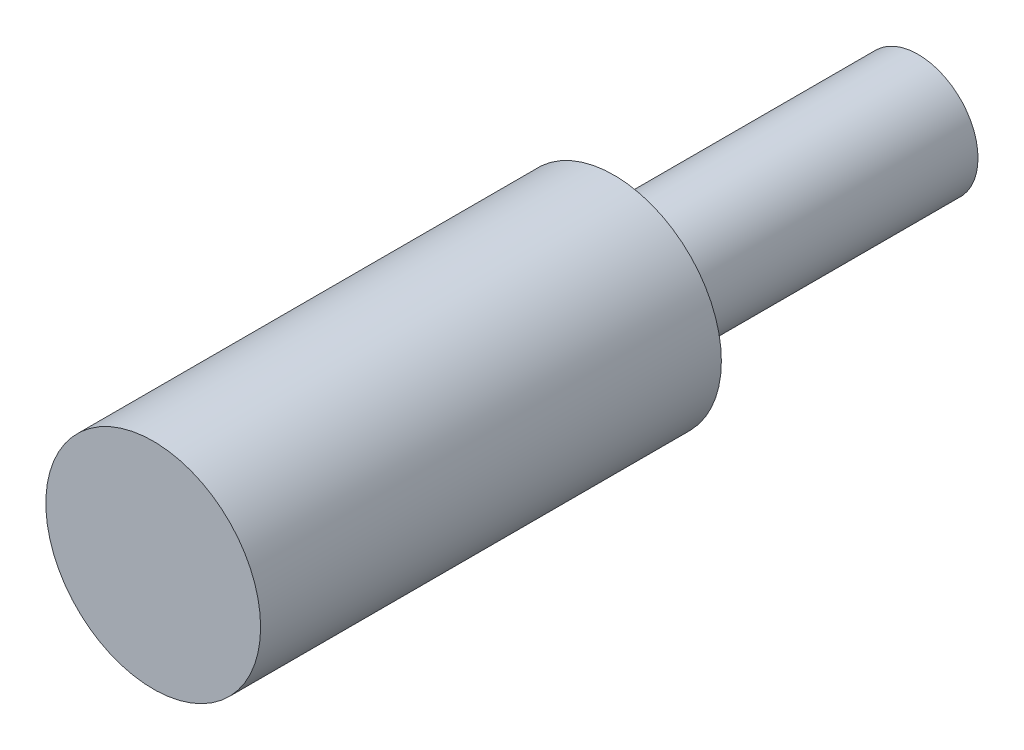
ISO-10303-21;
HEADER;
FILE_DESCRIPTION(('STEP AP214'),'2;1');
FILE_NAME('part.step','',(''),(''),'','','');
FILE_SCHEMA(('AUTOMOTIVE_DESIGN { 1 0 10303 214 1 1 1 1 }'));
ENDSEC;
DATA;
#1=APPLICATION_CONTEXT('core data for automotive mechanical design processes');
#2=APPLICATION_PROTOCOL_DEFINITION('international standard','automotive_design',2000,#1);
#3=PRODUCT_CONTEXT('',#1,'mechanical');
#4=PRODUCT('Part','Part','',(#3));
#5=PRODUCT_RELATED_PRODUCT_CATEGORY('part','',(#4));
#6=PRODUCT_DEFINITION_FORMATION('','',#4);
#7=PRODUCT_DEFINITION_CONTEXT('part definition',#1,'design');
#8=PRODUCT_DEFINITION('design','',#6,#7);
#9=PRODUCT_DEFINITION_SHAPE('','',#8);
#10=(LENGTH_UNIT() NAMED_UNIT(*) SI_UNIT(.MILLI.,.METRE.));
#11=(NAMED_UNIT(*) PLANE_ANGLE_UNIT() SI_UNIT($,.RADIAN.));
#12=(NAMED_UNIT(*) SI_UNIT($,.STERADIAN.) SOLID_ANGLE_UNIT());
#13=UNCERTAINTY_MEASURE_WITH_UNIT(LENGTH_MEASURE(1.E-05),#10,'distance_accuracy_value','');
#14=(GEOMETRIC_REPRESENTATION_CONTEXT(3) GLOBAL_UNCERTAINTY_ASSIGNED_CONTEXT((#13)) GLOBAL_UNIT_ASSIGNED_CONTEXT((#10,
#11,#12)) REPRESENTATION_CONTEXT('',''));
#15=CARTESIAN_POINT('',(0.,0.,0.));
#16=DIRECTION('',(0.,0.,1.));
#17=DIRECTION('',(1.,0.,0.));
#18=AXIS2_PLACEMENT_3D('',#15,#16,#17);
#19=CARTESIAN_POINT('',(0.,0.,33.));
#20=DIRECTION('',(0.,0.,-1.));
#21=DIRECTION('',(-1.,0.,0.));
#22=AXIS2_PLACEMENT_3D('',#19,#20,#21);
#23=CYLINDRICAL_SURFACE('',#22,6.5);
#24=CARTESIAN_POINT('',(0.,0.,33.));
#25=DIRECTION('',(0.,0.,1.));
#26=DIRECTION('',(1.,0.,0.));
#27=AXIS2_PLACEMENT_3D('',#24,#25,#26);
#28=CIRCLE('',#27,6.5);
#29=CARTESIAN_POINT('',(6.5,0.,33.));
#30=VERTEX_POINT('',#29);
#31=EDGE_CURVE('E10',#30,#30,#28,.T.);
#32=ORIENTED_EDGE('',*,*,#31,.F.);
#33=EDGE_LOOP('',(#32));
#34=FACE_BOUND('',#33,.T.);
#35=CARTESIAN_POINT('',(0.,0.,0.));
#36=DIRECTION('',(0.,0.,1.));
#37=DIRECTION('',(1.,0.,0.));
#38=AXIS2_PLACEMENT_3D('',#35,#36,#37);
#39=CIRCLE('',#38,6.5);
#40=CARTESIAN_POINT('',(6.5,0.,0.));
#41=VERTEX_POINT('',#40);
#42=EDGE_CURVE('E34',#41,#41,#39,.T.);
#43=ORIENTED_EDGE('',*,*,#42,.T.);
#44=EDGE_LOOP('',(#43));
#45=FACE_BOUND('',#44,.T.);
#46=ADVANCED_FACE('F31',(#34,#45),#23,.T.);
#47=CARTESIAN_POINT('',(0.,0.,0.));
#48=DIRECTION('',(0.,0.,1.));
#49=DIRECTION('',(1.,0.,0.));
#50=AXIS2_PLACEMENT_3D('',#47,#48,#49);
#51=PLANE('',#50);
#52=ORIENTED_EDGE('',*,*,#42,.F.);
#53=EDGE_LOOP('',(#52));
#54=FACE_BOUND('',#53,.T.);
#55=ADVANCED_FACE('F54',(#54),#51,.F.);
#56=CARTESIAN_POINT('',(0.,0.,83.));
#57=DIRECTION('',(0.,0.,-1.));
#58=DIRECTION('',(-1.,0.,0.));
#59=AXIS2_PLACEMENT_3D('',#56,#57,#58);
#60=CYLINDRICAL_SURFACE('',#59,11.6526578944464);
#61=CARTESIAN_POINT('',(0.,0.,83.));
#62=DIRECTION('',(0.,0.,1.));
#63=DIRECTION('',(1.,0.,0.));
#64=AXIS2_PLACEMENT_3D('',#61,#62,#63);
#65=CIRCLE('',#64,11.6526578944464);
#66=CARTESIAN_POINT('',(11.6526578944464,0.,83.));
#67=VERTEX_POINT('',#66);
#68=EDGE_CURVE('E41',#67,#67,#65,.T.);
#69=ORIENTED_EDGE('',*,*,#68,.F.);
#70=EDGE_LOOP('',(#69));
#71=FACE_BOUND('',#70,.T.);
#72=CARTESIAN_POINT('',(0.,0.,33.));
#73=DIRECTION('',(0.,0.,1.));
#74=DIRECTION('',(1.,0.,0.));
#75=AXIS2_PLACEMENT_3D('',#72,#73,#74);
#76=CIRCLE('',#75,11.6526578944464);
#77=CARTESIAN_POINT('',(11.6526578944464,0.,33.));
#78=VERTEX_POINT('',#77);
#79=EDGE_CURVE('E43',#78,#78,#76,.T.);
#80=ORIENTED_EDGE('',*,*,#79,.T.);
#81=EDGE_LOOP('',(#80));
#82=FACE_BOUND('',#81,.T.);
#83=ADVANCED_FACE('F51',(#71,#82),#60,.T.);
#84=CARTESIAN_POINT('',(0.,0.,83.));
#85=DIRECTION('',(0.,0.,1.));
#86=DIRECTION('',(1.,0.,0.));
#87=AXIS2_PLACEMENT_3D('',#84,#85,#86);
#88=PLANE('',#87);
#89=ORIENTED_EDGE('',*,*,#68,.T.);
#90=EDGE_LOOP('',(#89));
#91=FACE_BOUND('',#90,.T.);
#92=ADVANCED_FACE('F49',(#91),#88,.T.);
#93=CARTESIAN_POINT('',(0.,0.,33.));
#94=DIRECTION('',(0.,0.,1.));
#95=DIRECTION('',(1.,0.,0.));
#96=AXIS2_PLACEMENT_3D('',#93,#94,#95);
#97=PLANE('',#96);
#98=ORIENTED_EDGE('',*,*,#31,.T.);
#99=EDGE_LOOP('',(#98));
#100=FACE_BOUND('',#99,.T.);
#101=ORIENTED_EDGE('',*,*,#79,.F.);
#102=EDGE_LOOP('',(#101));
#103=FACE_BOUND('',#102,.T.);
#104=ADVANCED_FACE('F58',(#100,#103),#97,.F.);
#105=CLOSED_SHELL('',(#46,#55,#83,#92,#104));
#106=MANIFOLD_SOLID_BREP('B2',#105);
#107=ADVANCED_BREP_SHAPE_REPRESENTATION('',(#18,#106),#14);
#108=SHAPE_DEFINITION_REPRESENTATION(#9,#107);
ENDSEC;
END-ISO-10303-21;
